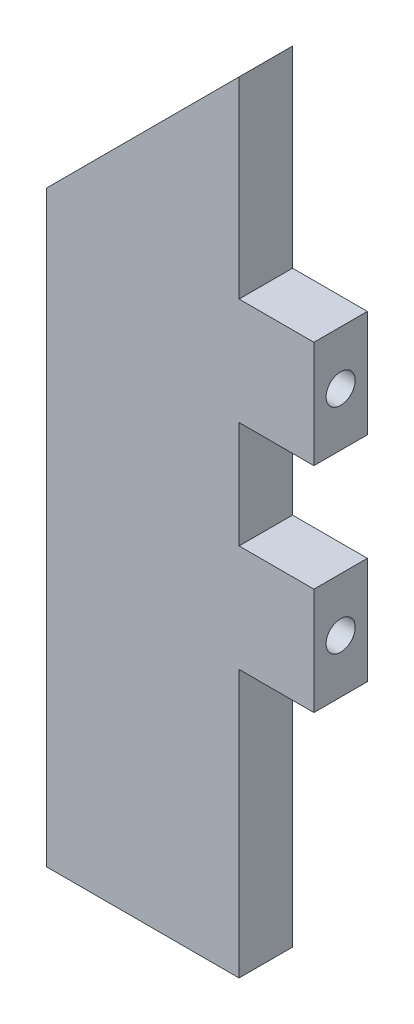
ISO-10303-21;
HEADER;
FILE_DESCRIPTION(('STEP AP214'),'2;1');
FILE_NAME('part.step','',(''),(''),'','','');
FILE_SCHEMA(('AUTOMOTIVE_DESIGN { 1 0 10303 214 1 1 1 1 }'));
ENDSEC;
DATA;
#1=APPLICATION_CONTEXT('core data for automotive mechanical design processes');
#2=APPLICATION_PROTOCOL_DEFINITION('international standard','automotive_design',2000,#1);
#3=PRODUCT_CONTEXT('',#1,'mechanical');
#4=PRODUCT('Part','Part','',(#3));
#5=PRODUCT_RELATED_PRODUCT_CATEGORY('part','',(#4));
#6=PRODUCT_DEFINITION_FORMATION('','',#4);
#7=PRODUCT_DEFINITION_CONTEXT('part definition',#1,'design');
#8=PRODUCT_DEFINITION('design','',#6,#7);
#9=PRODUCT_DEFINITION_SHAPE('','',#8);
#10=(LENGTH_UNIT() NAMED_UNIT(*) SI_UNIT(.MILLI.,.METRE.));
#11=(NAMED_UNIT(*) PLANE_ANGLE_UNIT() SI_UNIT($,.RADIAN.));
#12=(NAMED_UNIT(*) SI_UNIT($,.STERADIAN.) SOLID_ANGLE_UNIT());
#13=UNCERTAINTY_MEASURE_WITH_UNIT(LENGTH_MEASURE(1.E-05),#10,'distance_accuracy_value','');
#14=(GEOMETRIC_REPRESENTATION_CONTEXT(3) GLOBAL_UNCERTAINTY_ASSIGNED_CONTEXT((#13)) GLOBAL_UNIT_ASSIGNED_CONTEXT((#10,
#11,#12)) REPRESENTATION_CONTEXT('',''));
#15=CARTESIAN_POINT('',(0.,0.,0.));
#16=DIRECTION('',(0.,0.,1.));
#17=DIRECTION('',(1.,0.,0.));
#18=AXIS2_PLACEMENT_3D('',#15,#16,#17);
#19=CARTESIAN_POINT('',(31.75,101.6,0.));
#20=DIRECTION('',(-1.,0.,0.));
#21=DIRECTION('',(0.,0.,1.));
#22=AXIS2_PLACEMENT_3D('',#19,#20,#21);
#23=PLANE('',#22);
#24=CARTESIAN_POINT('',(31.75,38.1,-3.175));
#25=DIRECTION('',(1.,0.,0.));
#26=DIRECTION('',(0.,0.,-1.));
#27=AXIS2_PLACEMENT_3D('',#24,#25,#26);
#28=CIRCLE('',#27,1.7272);
#29=CARTESIAN_POINT('',(31.75,38.1,-4.9022));
#30=VERTEX_POINT('',#29);
#31=EDGE_CURVE('E237',#30,#30,#28,.T.);
#32=ORIENTED_EDGE('',*,*,#31,.F.);
#33=EDGE_LOOP('',(#32));
#34=FACE_BOUND('',#33,.T.);
#35=DIRECTION('',(0.,-1.,0.));
#36=VECTOR('',#35,1.);
#37=CARTESIAN_POINT('',(31.75,101.6,0.));
#38=LINE('',#37,#36);
#39=CARTESIAN_POINT('',(31.75,44.45,0.));
#40=VERTEX_POINT('',#39);
#41=CARTESIAN_POINT('',(31.75,31.75,0.));
#42=VERTEX_POINT('',#41);
#43=EDGE_CURVE('E178',#40,#42,#38,.T.);
#44=ORIENTED_EDGE('',*,*,#43,.T.);
#45=DIRECTION('',(0.,0.,1.));
#46=VECTOR('',#45,1.);
#47=CARTESIAN_POINT('',(31.75,31.75,-6.35));
#48=LINE('',#47,#46);
#49=CARTESIAN_POINT('',(31.75,31.75,-6.35));
#50=VERTEX_POINT('',#49);
#51=EDGE_CURVE('E148',#50,#42,#48,.T.);
#52=ORIENTED_EDGE('',*,*,#51,.F.);
#53=DIRECTION('',(0.,-1.,0.));
#54=VECTOR('',#53,1.);
#55=CARTESIAN_POINT('',(31.75,101.6,-6.35));
#56=LINE('',#55,#54);
#57=CARTESIAN_POINT('',(31.75,44.45,-6.35));
#58=VERTEX_POINT('',#57);
#59=EDGE_CURVE('E170',#58,#50,#56,.T.);
#60=ORIENTED_EDGE('',*,*,#59,.F.);
#61=DIRECTION('',(0.,0.,1.));
#62=VECTOR('',#61,1.);
#63=CARTESIAN_POINT('',(31.75,44.45,-6.35));
#64=LINE('',#63,#62);
#65=EDGE_CURVE('E251',#58,#40,#64,.T.);
#66=ORIENTED_EDGE('',*,*,#65,.T.);
#67=EDGE_LOOP('',(#44,#52,#60,#66));
#68=FACE_BOUND('',#67,.T.);
#69=ADVANCED_FACE('F44',(#34,#68),#23,.F.);
#70=CARTESIAN_POINT('',(0.,101.6,0.));
#71=DIRECTION('',(1.,0.,0.));
#72=DIRECTION('',(0.,0.,-1.));
#73=AXIS2_PLACEMENT_3D('',#70,#71,#72);
#74=PLANE('',#73);
#75=DIRECTION('',(0.,-1.,0.));
#76=VECTOR('',#75,1.);
#77=CARTESIAN_POINT('',(0.,101.6,0.));
#78=LINE('',#77,#76);
#79=CARTESIAN_POINT('',(0.,69.8499999999999,0.));
#80=VERTEX_POINT('',#79);
#81=CARTESIAN_POINT('',(0.,0.,0.));
#82=VERTEX_POINT('',#81);
#83=EDGE_CURVE('E183',#80,#82,#78,.T.);
#84=ORIENTED_EDGE('',*,*,#83,.F.);
#85=DIRECTION('',(0.,0.,-1.));
#86=VECTOR('',#85,1.);
#87=CARTESIAN_POINT('',(0.,69.8499999999999,0.));
#88=LINE('',#87,#86);
#89=CARTESIAN_POINT('',(0.,69.8499999999999,-6.35));
#90=VERTEX_POINT('',#89);
#91=EDGE_CURVE('E189',#80,#90,#88,.T.);
#92=ORIENTED_EDGE('',*,*,#91,.T.);
#93=DIRECTION('',(0.,-1.,0.));
#94=VECTOR('',#93,1.);
#95=CARTESIAN_POINT('',(0.,101.6,-6.35));
#96=LINE('',#95,#94);
#97=CARTESIAN_POINT('',(0.,0.,-6.35));
#98=VERTEX_POINT('',#97);
#99=EDGE_CURVE('E165',#90,#98,#96,.T.);
#100=ORIENTED_EDGE('',*,*,#99,.T.);
#101=DIRECTION('',(0.,0.,1.));
#102=VECTOR('',#101,1.);
#103=CARTESIAN_POINT('',(0.,0.,0.));
#104=LINE('',#103,#102);
#105=EDGE_CURVE('E163',#98,#82,#104,.T.);
#106=ORIENTED_EDGE('',*,*,#105,.T.);
#107=EDGE_LOOP('',(#84,#92,#100,#106));
#108=FACE_BOUND('',#107,.T.);
#109=ADVANCED_FACE('F246',(#108),#74,.F.);
#110=CARTESIAN_POINT('',(0.,101.6,0.));
#111=DIRECTION('',(0.,0.,-1.));
#112=DIRECTION('',(-1.,0.,0.));
#113=AXIS2_PLACEMENT_3D('',#110,#111,#112);
#114=PLANE('',#113);
#115=DIRECTION('',(1.,0.,0.));
#116=VECTOR('',#115,1.);
#117=CARTESIAN_POINT('',(0.,0.,0.));
#118=LINE('',#117,#116);
#119=CARTESIAN_POINT('',(22.86,0.,0.));
#120=VERTEX_POINT('',#119);
#121=EDGE_CURVE('E166',#82,#120,#118,.T.);
#122=ORIENTED_EDGE('',*,*,#121,.T.);
#123=DIRECTION('',(0.,-1.,0.));
#124=VECTOR('',#123,1.);
#125=CARTESIAN_POINT('',(22.86,0.,0.));
#126=LINE('',#125,#124);
#127=CARTESIAN_POINT('',(22.86,31.75,0.));
#128=VERTEX_POINT('',#127);
#129=EDGE_CURVE('E69',#128,#120,#126,.T.);
#130=ORIENTED_EDGE('',*,*,#129,.F.);
#131=DIRECTION('',(-1.,0.,0.));
#132=VECTOR('',#131,1.);
#133=CARTESIAN_POINT('',(22.86,31.75,0.));
#134=LINE('',#133,#132);
#135=EDGE_CURVE('E158',#42,#128,#134,.T.);
#136=ORIENTED_EDGE('',*,*,#135,.F.);
#137=ORIENTED_EDGE('',*,*,#43,.F.);
#138=DIRECTION('',(1.,0.,0.));
#139=VECTOR('',#138,1.);
#140=CARTESIAN_POINT('',(31.75,44.45,0.));
#141=LINE('',#140,#139);
#142=CARTESIAN_POINT('',(22.86,44.45,0.));
#143=VERTEX_POINT('',#142);
#144=EDGE_CURVE('E269',#143,#40,#141,.T.);
#145=ORIENTED_EDGE('',*,*,#144,.F.);
#146=DIRECTION('',(0.,-1.,0.));
#147=VECTOR('',#146,1.);
#148=CARTESIAN_POINT('',(22.86,44.45,0.));
#149=LINE('',#148,#147);
#150=CARTESIAN_POINT('',(22.86,57.15,0.));
#151=VERTEX_POINT('',#150);
#152=EDGE_CURVE('E280',#151,#143,#149,.T.);
#153=ORIENTED_EDGE('',*,*,#152,.F.);
#154=DIRECTION('',(-1.,0.,0.));
#155=VECTOR('',#154,1.);
#156=CARTESIAN_POINT('',(31.75,57.15,0.));
#157=LINE('',#156,#155);
#158=CARTESIAN_POINT('',(31.75,57.15,0.));
#159=VERTEX_POINT('',#158);
#160=EDGE_CURVE('E224',#159,#151,#157,.T.);
#161=ORIENTED_EDGE('',*,*,#160,.F.);
#162=CARTESIAN_POINT('',(31.75,69.85,0.));
#163=VERTEX_POINT('',#162);
#164=EDGE_CURVE('E182',#163,#159,#38,.T.);
#165=ORIENTED_EDGE('',*,*,#164,.F.);
#166=DIRECTION('',(1.,0.,0.));
#167=VECTOR('',#166,1.);
#168=CARTESIAN_POINT('',(31.75,69.85,0.));
#169=LINE('',#168,#167);
#170=CARTESIAN_POINT('',(22.86,69.85,0.));
#171=VERTEX_POINT('',#170);
#172=EDGE_CURVE('E211',#171,#163,#169,.T.);
#173=ORIENTED_EDGE('',*,*,#172,.F.);
#174=DIRECTION('',(0.,-1.,0.));
#175=VECTOR('',#174,1.);
#176=CARTESIAN_POINT('',(22.86,69.85,0.));
#177=LINE('',#176,#175);
#178=CARTESIAN_POINT('',(22.86,92.71,0.));
#179=VERTEX_POINT('',#178);
#180=EDGE_CURVE('E204',#179,#171,#177,.T.);
#181=ORIENTED_EDGE('',*,*,#180,.F.);
#182=DIRECTION('',(0.707106781186546,0.707106781186549,0.));
#183=VECTOR('',#182,1.);
#184=CARTESIAN_POINT('',(31.75,101.6,0.));
#185=LINE('',#184,#183);
#186=EDGE_CURVE('E186',#179,#80,#185,.F.);
#187=ORIENTED_EDGE('',*,*,#186,.T.);
#188=ORIENTED_EDGE('',*,*,#83,.T.);
#189=EDGE_LOOP('',(#122,#130,#136,#137,#145,#153,#161,#165,#173,#181,#187,#188));
#190=FACE_BOUND('',#189,.T.);
#191=ADVANCED_FACE('F208',(#190),#114,.F.);
#192=CARTESIAN_POINT('',(31.75,63.5,-3.175));
#193=DIRECTION('',(1.,0.,0.));
#194=DIRECTION('',(0.,0.,-1.));
#195=AXIS2_PLACEMENT_3D('',#192,#193,#194);
#196=CIRCLE('',#195,1.7272);
#197=CARTESIAN_POINT('',(31.75,63.5,-4.9022));
#198=VERTEX_POINT('',#197);
#199=EDGE_CURVE('E228',#198,#198,#196,.T.);
#200=ORIENTED_EDGE('',*,*,#199,.F.);
#201=EDGE_LOOP('',(#200));
#202=FACE_BOUND('',#201,.T.);
#203=ORIENTED_EDGE('',*,*,#164,.T.);
#204=DIRECTION('',(0.,0.,1.));
#205=VECTOR('',#204,1.);
#206=CARTESIAN_POINT('',(31.75,57.15,-6.35));
#207=LINE('',#206,#205);
#208=CARTESIAN_POINT('',(31.75,57.15,-6.35));
#209=VERTEX_POINT('',#208);
#210=EDGE_CURVE('E276',#209,#159,#207,.T.);
#211=ORIENTED_EDGE('',*,*,#210,.F.);
#212=CARTESIAN_POINT('',(31.75,69.85,-6.35));
#213=VERTEX_POINT('',#212);
#214=EDGE_CURVE('E177',#213,#209,#56,.T.);
#215=ORIENTED_EDGE('',*,*,#214,.F.);
#216=DIRECTION('',(0.,0.,1.));
#217=VECTOR('',#216,1.);
#218=CARTESIAN_POINT('',(31.75,69.85,-6.35));
#219=LINE('',#218,#217);
#220=EDGE_CURVE('E220',#213,#163,#219,.T.);
#221=ORIENTED_EDGE('',*,*,#220,.T.);
#222=EDGE_LOOP('',(#203,#211,#215,#221));
#223=FACE_BOUND('',#222,.T.);
#224=ADVANCED_FACE('F301',(#202,#223),#23,.F.);
#225=CARTESIAN_POINT('',(0.,101.6,-6.35));
#226=DIRECTION('',(0.,0.,1.));
#227=DIRECTION('',(1.,0.,0.));
#228=AXIS2_PLACEMENT_3D('',#225,#226,#227);
#229=PLANE('',#228);
#230=DIRECTION('',(-1.,0.,0.));
#231=VECTOR('',#230,1.);
#232=CARTESIAN_POINT('',(22.86,31.75,-6.35));
#233=LINE('',#232,#231);
#234=CARTESIAN_POINT('',(22.86,31.75,-6.35));
#235=VERTEX_POINT('',#234);
#236=EDGE_CURVE('E149',#50,#235,#233,.T.);
#237=ORIENTED_EDGE('',*,*,#236,.T.);
#238=DIRECTION('',(0.,-1.,0.));
#239=VECTOR('',#238,1.);
#240=CARTESIAN_POINT('',(22.86,0.,-6.35));
#241=LINE('',#240,#239);
#242=CARTESIAN_POINT('',(22.86,0.,-6.35));
#243=VERTEX_POINT('',#242);
#244=EDGE_CURVE('E141',#235,#243,#241,.T.);
#245=ORIENTED_EDGE('',*,*,#244,.T.);
#246=DIRECTION('',(-1.,0.,0.));
#247=VECTOR('',#246,1.);
#248=CARTESIAN_POINT('',(0.,0.,-6.35));
#249=LINE('',#248,#247);
#250=EDGE_CURVE('E154',#243,#98,#249,.T.);
#251=ORIENTED_EDGE('',*,*,#250,.T.);
#252=ORIENTED_EDGE('',*,*,#99,.F.);
#253=DIRECTION('',(-0.707106781186546,-0.707106781186549,0.));
#254=VECTOR('',#253,1.);
#255=CARTESIAN_POINT('',(31.75,101.6,-6.35));
#256=LINE('',#255,#254);
#257=CARTESIAN_POINT('',(22.86,92.71,-6.35));
#258=VERTEX_POINT('',#257);
#259=EDGE_CURVE('E54',#90,#258,#256,.F.);
#260=ORIENTED_EDGE('',*,*,#259,.T.);
#261=DIRECTION('',(0.,-1.,0.));
#262=VECTOR('',#261,1.);
#263=CARTESIAN_POINT('',(22.86,69.85,-6.35));
#264=LINE('',#263,#262);
#265=CARTESIAN_POINT('',(22.86,69.85,-6.35));
#266=VERTEX_POINT('',#265);
#267=EDGE_CURVE('E196',#258,#266,#264,.T.);
#268=ORIENTED_EDGE('',*,*,#267,.T.);
#269=DIRECTION('',(1.,0.,0.));
#270=VECTOR('',#269,1.);
#271=CARTESIAN_POINT('',(31.75,69.85,-6.35));
#272=LINE('',#271,#270);
#273=EDGE_CURVE('E217',#266,#213,#272,.T.);
#274=ORIENTED_EDGE('',*,*,#273,.T.);
#275=ORIENTED_EDGE('',*,*,#214,.T.);
#276=DIRECTION('',(-1.,0.,0.));
#277=VECTOR('',#276,1.);
#278=CARTESIAN_POINT('',(31.75,57.15,-6.35));
#279=LINE('',#278,#277);
#280=CARTESIAN_POINT('',(22.86,57.15,-6.35));
#281=VERTEX_POINT('',#280);
#282=EDGE_CURVE('E265',#209,#281,#279,.T.);
#283=ORIENTED_EDGE('',*,*,#282,.T.);
#284=DIRECTION('',(0.,-1.,0.));
#285=VECTOR('',#284,1.);
#286=CARTESIAN_POINT('',(22.86,44.45,-6.35));
#287=LINE('',#286,#285);
#288=CARTESIAN_POINT('',(22.86,44.45,-6.35));
#289=VERTEX_POINT('',#288);
#290=EDGE_CURVE('E61',#281,#289,#287,.T.);
#291=ORIENTED_EDGE('',*,*,#290,.T.);
#292=DIRECTION('',(1.,0.,0.));
#293=VECTOR('',#292,1.);
#294=CARTESIAN_POINT('',(31.75,44.45,-6.35));
#295=LINE('',#294,#293);
#296=EDGE_CURVE('E272',#289,#58,#295,.T.);
#297=ORIENTED_EDGE('',*,*,#296,.T.);
#298=ORIENTED_EDGE('',*,*,#59,.T.);
#299=EDGE_LOOP('',(#237,#245,#251,#252,#260,#268,#274,#275,#283,#291,#297,#298));
#300=FACE_BOUND('',#299,.T.);
#301=ADVANCED_FACE('F152',(#300),#229,.F.);
#302=CARTESIAN_POINT('',(0.,0.,0.));
#303=DIRECTION('',(0.,-1.,0.));
#304=DIRECTION('',(0.,0.,-1.));
#305=AXIS2_PLACEMENT_3D('',#302,#303,#304);
#306=PLANE('',#305);
#307=DIRECTION('',(0.,0.,1.));
#308=VECTOR('',#307,1.);
#309=CARTESIAN_POINT('',(22.86,0.,-6.35));
#310=LINE('',#309,#308);
#311=EDGE_CURVE('E138',#243,#120,#310,.T.);
#312=ORIENTED_EDGE('',*,*,#311,.T.);
#313=ORIENTED_EDGE('',*,*,#121,.F.);
#314=ORIENTED_EDGE('',*,*,#105,.F.);
#315=ORIENTED_EDGE('',*,*,#250,.F.);
#316=EDGE_LOOP('',(#312,#313,#314,#315));
#317=FACE_BOUND('',#316,.T.);
#318=ADVANCED_FACE('F161',(#317),#306,.T.);
#319=CARTESIAN_POINT('',(31.75,101.6,0.));
#320=DIRECTION('',(0.707106781186549,-0.707106781186546,0.));
#321=DIRECTION('',(0.,0.,1.));
#322=AXIS2_PLACEMENT_3D('',#319,#320,#321);
#323=PLANE('',#322);
#324=DIRECTION('',(0.,0.,-1.));
#325=VECTOR('',#324,1.);
#326=CARTESIAN_POINT('',(22.86,92.71,0.));
#327=LINE('',#326,#325);
#328=EDGE_CURVE('E11',#258,#179,#327,.F.);
#329=ORIENTED_EDGE('',*,*,#328,.F.);
#330=ORIENTED_EDGE('',*,*,#259,.F.);
#331=ORIENTED_EDGE('',*,*,#91,.F.);
#332=ORIENTED_EDGE('',*,*,#186,.F.);
#333=EDGE_LOOP('',(#329,#330,#331,#332));
#334=FACE_BOUND('',#333,.T.);
#335=ADVANCED_FACE('F47',(#334),#323,.F.);
#336=CARTESIAN_POINT('',(25.4,38.1,-3.175));
#337=DIRECTION('',(1.,0.,0.));
#338=DIRECTION('',(0.,0.,-1.));
#339=AXIS2_PLACEMENT_3D('',#336,#337,#338);
#340=CONICAL_SURFACE('',#339,1.7272,1.02974425867665);
#341=CARTESIAN_POINT('',(24.3621935388156,38.1,-3.175));
#342=VERTEX_POINT('',#341);
#343=VERTEX_LOOP('',#342);
#344=FACE_BOUND('',#343,.T.);
#345=CARTESIAN_POINT('',(25.4,38.1,-3.175));
#346=DIRECTION('',(1.,0.,0.));
#347=DIRECTION('',(0.,0.,-1.));
#348=AXIS2_PLACEMENT_3D('',#345,#346,#347);
#349=CIRCLE('',#348,1.7272);
#350=CARTESIAN_POINT('',(25.4,38.1,-4.9022));
#351=VERTEX_POINT('',#350);
#352=EDGE_CURVE('E241',#351,#351,#349,.T.);
#353=ORIENTED_EDGE('',*,*,#352,.T.);
#354=EDGE_LOOP('',(#353));
#355=FACE_BOUND('',#354,.T.);
#356=ADVANCED_FACE('F366',(#344,#355),#340,.F.);
#357=CARTESIAN_POINT('',(31.75,38.1,-3.175));
#358=DIRECTION('',(1.,0.,0.));
#359=DIRECTION('',(0.,0.,-1.));
#360=AXIS2_PLACEMENT_3D('',#357,#358,#359);
#361=CYLINDRICAL_SURFACE('',#360,1.7272);
#362=ORIENTED_EDGE('',*,*,#352,.F.);
#363=EDGE_LOOP('',(#362));
#364=FACE_BOUND('',#363,.T.);
#365=ORIENTED_EDGE('',*,*,#31,.T.);
#366=EDGE_LOOP('',(#365));
#367=FACE_BOUND('',#366,.T.);
#368=ADVANCED_FACE('F359',(#364,#367),#361,.F.);
#369=CARTESIAN_POINT('',(25.4,63.5,-3.175));
#370=DIRECTION('',(1.,0.,0.));
#371=DIRECTION('',(0.,0.,-1.));
#372=AXIS2_PLACEMENT_3D('',#369,#370,#371);
#373=CONICAL_SURFACE('',#372,1.7272,1.02974425867665);
#374=CARTESIAN_POINT('',(24.3621935388156,63.5,-3.175));
#375=VERTEX_POINT('',#374);
#376=VERTEX_LOOP('',#375);
#377=FACE_BOUND('',#376,.T.);
#378=CARTESIAN_POINT('',(25.4,63.5,-3.175));
#379=DIRECTION('',(1.,0.,0.));
#380=DIRECTION('',(0.,0.,-1.));
#381=AXIS2_PLACEMENT_3D('',#378,#379,#380);
#382=CIRCLE('',#381,1.7272);
#383=CARTESIAN_POINT('',(25.4,63.5,-4.9022));
#384=VERTEX_POINT('',#383);
#385=EDGE_CURVE('E232',#384,#384,#382,.T.);
#386=ORIENTED_EDGE('',*,*,#385,.T.);
#387=EDGE_LOOP('',(#386));
#388=FACE_BOUND('',#387,.T.);
#389=ADVANCED_FACE('F349',(#377,#388),#373,.F.);
#390=CARTESIAN_POINT('',(31.75,63.5,-3.175));
#391=DIRECTION('',(1.,0.,0.));
#392=DIRECTION('',(0.,0.,-1.));
#393=AXIS2_PLACEMENT_3D('',#390,#391,#392);
#394=CYLINDRICAL_SURFACE('',#393,1.7272);
#395=ORIENTED_EDGE('',*,*,#385,.F.);
#396=EDGE_LOOP('',(#395));
#397=FACE_BOUND('',#396,.T.);
#398=ORIENTED_EDGE('',*,*,#199,.T.);
#399=EDGE_LOOP('',(#398));
#400=FACE_BOUND('',#399,.T.);
#401=ADVANCED_FACE('F346',(#397,#400),#394,.F.);
#402=CARTESIAN_POINT('',(31.75,69.85,-6.35));
#403=DIRECTION('',(0.,-1.,0.));
#404=DIRECTION('',(0.,0.,-1.));
#405=AXIS2_PLACEMENT_3D('',#402,#403,#404);
#406=PLANE('',#405);
#407=ORIENTED_EDGE('',*,*,#172,.T.);
#408=ORIENTED_EDGE('',*,*,#220,.F.);
#409=ORIENTED_EDGE('',*,*,#273,.F.);
#410=DIRECTION('',(0.,0.,1.));
#411=VECTOR('',#410,1.);
#412=CARTESIAN_POINT('',(22.86,69.85,-6.35));
#413=LINE('',#412,#411);
#414=EDGE_CURVE('E225',#266,#171,#413,.T.);
#415=ORIENTED_EDGE('',*,*,#414,.T.);
#416=EDGE_LOOP('',(#407,#408,#409,#415));
#417=FACE_BOUND('',#416,.T.);
#418=ADVANCED_FACE('F348',(#417),#406,.F.);
#419=CARTESIAN_POINT('',(22.86,69.85,-6.35));
#420=DIRECTION('',(-1.,0.,0.));
#421=DIRECTION('',(0.,0.,1.));
#422=AXIS2_PLACEMENT_3D('',#419,#420,#421);
#423=PLANE('',#422);
#424=ORIENTED_EDGE('',*,*,#328,.T.);
#425=ORIENTED_EDGE('',*,*,#180,.T.);
#426=ORIENTED_EDGE('',*,*,#414,.F.);
#427=ORIENTED_EDGE('',*,*,#267,.F.);
#428=EDGE_LOOP('',(#424,#425,#426,#427));
#429=FACE_BOUND('',#428,.T.);
#430=ADVANCED_FACE('F203',(#429),#423,.F.);
#431=CARTESIAN_POINT('',(22.86,0.,-6.35));
#432=DIRECTION('',(-1.,0.,0.));
#433=DIRECTION('',(0.,0.,1.));
#434=AXIS2_PLACEMENT_3D('',#431,#432,#433);
#435=PLANE('',#434);
#436=ORIENTED_EDGE('',*,*,#129,.T.);
#437=ORIENTED_EDGE('',*,*,#311,.F.);
#438=ORIENTED_EDGE('',*,*,#244,.F.);
#439=DIRECTION('',(0.,0.,1.));
#440=VECTOR('',#439,1.);
#441=CARTESIAN_POINT('',(22.86,31.75,-6.35));
#442=LINE('',#441,#440);
#443=EDGE_CURVE('E233',#235,#128,#442,.T.);
#444=ORIENTED_EDGE('',*,*,#443,.T.);
#445=EDGE_LOOP('',(#436,#437,#438,#444));
#446=FACE_BOUND('',#445,.T.);
#447=ADVANCED_FACE('F140',(#446),#435,.F.);
#448=CARTESIAN_POINT('',(22.86,31.75,-6.35));
#449=DIRECTION('',(0.,1.,0.));
#450=DIRECTION('',(0.,0.,1.));
#451=AXIS2_PLACEMENT_3D('',#448,#449,#450);
#452=PLANE('',#451);
#453=ORIENTED_EDGE('',*,*,#135,.T.);
#454=ORIENTED_EDGE('',*,*,#443,.F.);
#455=ORIENTED_EDGE('',*,*,#236,.F.);
#456=ORIENTED_EDGE('',*,*,#51,.T.);
#457=EDGE_LOOP('',(#453,#454,#455,#456));
#458=FACE_BOUND('',#457,.T.);
#459=ADVANCED_FACE('F315',(#458),#452,.F.);
#460=CARTESIAN_POINT('',(31.75,44.45,-6.35));
#461=DIRECTION('',(0.,-1.,0.));
#462=DIRECTION('',(0.,0.,-1.));
#463=AXIS2_PLACEMENT_3D('',#460,#461,#462);
#464=PLANE('',#463);
#465=ORIENTED_EDGE('',*,*,#144,.T.);
#466=ORIENTED_EDGE('',*,*,#65,.F.);
#467=ORIENTED_EDGE('',*,*,#296,.F.);
#468=DIRECTION('',(0.,0.,1.));
#469=VECTOR('',#468,1.);
#470=CARTESIAN_POINT('',(22.86,44.45,-6.35));
#471=LINE('',#470,#469);
#472=EDGE_CURVE('E257',#289,#143,#471,.T.);
#473=ORIENTED_EDGE('',*,*,#472,.T.);
#474=EDGE_LOOP('',(#465,#466,#467,#473));
#475=FACE_BOUND('',#474,.T.);
#476=ADVANCED_FACE('F318',(#475),#464,.F.);
#477=CARTESIAN_POINT('',(22.86,44.45,-6.35));
#478=DIRECTION('',(-1.,0.,0.));
#479=DIRECTION('',(0.,0.,1.));
#480=AXIS2_PLACEMENT_3D('',#477,#478,#479);
#481=PLANE('',#480);
#482=ORIENTED_EDGE('',*,*,#152,.T.);
#483=ORIENTED_EDGE('',*,*,#472,.F.);
#484=ORIENTED_EDGE('',*,*,#290,.F.);
#485=DIRECTION('',(0.,0.,1.));
#486=VECTOR('',#485,1.);
#487=CARTESIAN_POINT('',(22.86,57.15,-6.35));
#488=LINE('',#487,#486);
#489=EDGE_CURVE('E288',#281,#151,#488,.T.);
#490=ORIENTED_EDGE('',*,*,#489,.T.);
#491=EDGE_LOOP('',(#482,#483,#484,#490));
#492=FACE_BOUND('',#491,.T.);
#493=ADVANCED_FACE('F324',(#492),#481,.F.);
#494=CARTESIAN_POINT('',(31.75,57.15,-6.35));
#495=DIRECTION('',(0.,1.,0.));
#496=DIRECTION('',(0.,0.,1.));
#497=AXIS2_PLACEMENT_3D('',#494,#495,#496);
#498=PLANE('',#497);
#499=ORIENTED_EDGE('',*,*,#160,.T.);
#500=ORIENTED_EDGE('',*,*,#489,.F.);
#501=ORIENTED_EDGE('',*,*,#282,.F.);
#502=ORIENTED_EDGE('',*,*,#210,.T.);
#503=EDGE_LOOP('',(#499,#500,#501,#502));
#504=FACE_BOUND('',#503,.T.);
#505=ADVANCED_FACE('F308',(#504),#498,.F.);
#506=CLOSED_SHELL('',(#69,#109,#191,#224,#301,#318,#335,#356,#368,#389,#401,#418,#430,#447,#459,
#476,#493,#505));
#507=MANIFOLD_SOLID_BREP('B2',#506);
#508=ADVANCED_BREP_SHAPE_REPRESENTATION('',(#18,#507),#14);
#509=SHAPE_DEFINITION_REPRESENTATION(#9,#508);
ENDSEC;
END-ISO-10303-21;
